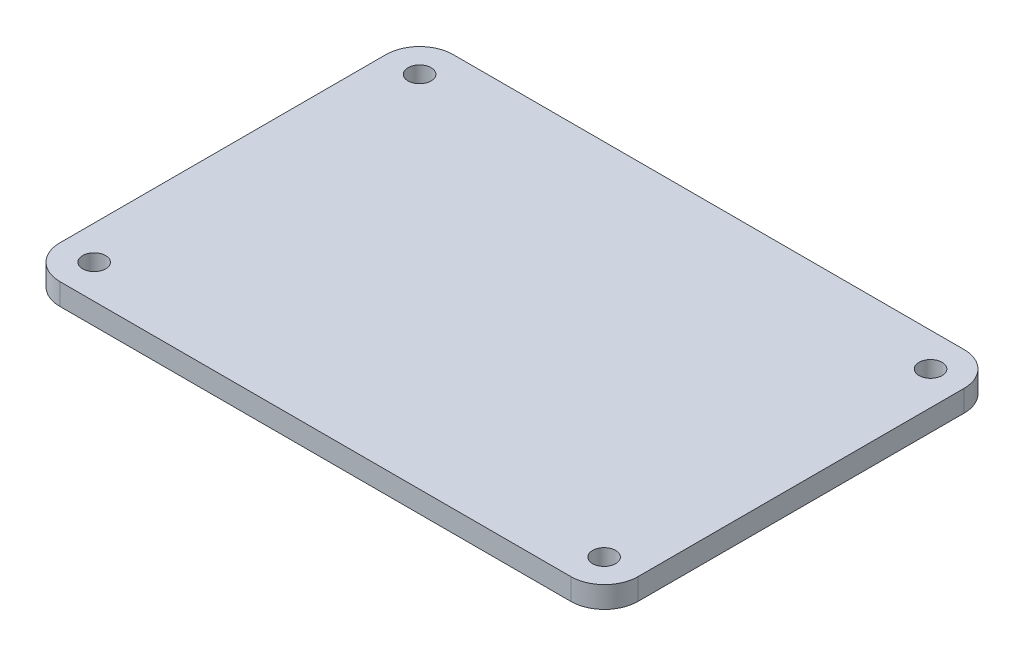
ISO-10303-21;
HEADER;
FILE_DESCRIPTION(('STEP AP214'),'2;1');
FILE_NAME('part.step','',(''),(''),'','','');
FILE_SCHEMA(('AUTOMOTIVE_DESIGN { 1 0 10303 214 1 1 1 1 }'));
ENDSEC;
DATA;
#1=APPLICATION_CONTEXT('core data for automotive mechanical design processes');
#2=APPLICATION_PROTOCOL_DEFINITION('international standard','automotive_design',2000,#1);
#3=PRODUCT_CONTEXT('',#1,'mechanical');
#4=PRODUCT('Part','Part','',(#3));
#5=PRODUCT_RELATED_PRODUCT_CATEGORY('part','',(#4));
#6=PRODUCT_DEFINITION_FORMATION('','',#4);
#7=PRODUCT_DEFINITION_CONTEXT('part definition',#1,'design');
#8=PRODUCT_DEFINITION('design','',#6,#7);
#9=PRODUCT_DEFINITION_SHAPE('','',#8);
#10=(LENGTH_UNIT() NAMED_UNIT(*) SI_UNIT(.MILLI.,.METRE.));
#11=(NAMED_UNIT(*) PLANE_ANGLE_UNIT() SI_UNIT($,.RADIAN.));
#12=(NAMED_UNIT(*) SI_UNIT($,.STERADIAN.) SOLID_ANGLE_UNIT());
#13=UNCERTAINTY_MEASURE_WITH_UNIT(LENGTH_MEASURE(1.E-05),#10,'distance_accuracy_value','');
#14=(GEOMETRIC_REPRESENTATION_CONTEXT(3) GLOBAL_UNCERTAINTY_ASSIGNED_CONTEXT((#13)) GLOBAL_UNIT_ASSIGNED_CONTEXT((#10,
#11,#12)) REPRESENTATION_CONTEXT('',''));
#15=CARTESIAN_POINT('',(0.,0.,0.));
#16=DIRECTION('',(0.,0.,1.));
#17=DIRECTION('',(1.,0.,0.));
#18=AXIS2_PLACEMENT_3D('',#15,#16,#17);
#19=CARTESIAN_POINT('',(110.992708305585,3.175,-138.788067041244));
#20=DIRECTION('',(0.,1.,0.));
#21=DIRECTION('',(0.,0.,1.));
#22=AXIS2_PLACEMENT_3D('',#19,#20,#21);
#23=PLANE('',#22);
#24=CARTESIAN_POINT('',(107.445530334738,3.175,-142.285856338533));
#25=DIRECTION('',(0.,1.,0.));
#26=DIRECTION('',(0.,0.,1.));
#27=AXIS2_PLACEMENT_3D('',#24,#25,#26);
#28=CIRCLE('',#27,1.7003914722854);
#29=CARTESIAN_POINT('',(107.445530334738,3.175,-140.585464866248));
#30=VERTEX_POINT('',#29);
#31=EDGE_CURVE('E217',#30,#30,#28,.T.);
#32=ORIENTED_EDGE('',*,*,#31,.F.);
#33=EDGE_LOOP('',(#32));
#34=FACE_BOUND('',#33,.T.);
#35=CARTESIAN_POINT('',(32.1803893114807,3.175,-190.337721151875));
#36=DIRECTION('',(0.,1.,0.));
#37=DIRECTION('',(0.,0.,1.));
#38=AXIS2_PLACEMENT_3D('',#35,#36,#37);
#39=CIRCLE('',#38,1.70038810793461);
#40=CARTESIAN_POINT('',(32.1803893114807,3.175,-188.63733304394));
#41=VERTEX_POINT('',#40);
#42=EDGE_CURVE('E229',#41,#41,#39,.T.);
#43=ORIENTED_EDGE('',*,*,#42,.F.);
#44=EDGE_LOOP('',(#43));
#45=FACE_BOUND('',#44,.T.);
#46=CARTESIAN_POINT('',(107.487861945513,3.175,-137.336384548185));
#47=CARTESIAN_POINT('',(110.22542094548,3.175,-137.336384548185));
#48=CARTESIAN_POINT('',(112.444385415682,3.175,-139.555359784311));
#49=CARTESIAN_POINT('',(112.444385415682,3.175,-142.292918784278));
#50=B_SPLINE_CURVE_WITH_KNOTS('',3,(#46,#47,#48,#49),.UNSPECIFIED.,.F.,.F.,(4,4),(7.,8.),.UNSPECIFIED.);
#51=CARTESIAN_POINT('',(107.487861945513,3.175,-137.336384548185));
#52=VERTEX_POINT('',#51);
#53=CARTESIAN_POINT('',(112.444385415682,3.175,-142.292918784278));
#54=VERTEX_POINT('',#53);
#55=EDGE_CURVE('E234',#52,#54,#50,.T.);
#56=ORIENTED_EDGE('',*,*,#55,.T.);
#57=DIRECTION('',(0.,0.,-1.));
#58=VECTOR('',#57,1.);
#59=CARTESIAN_POINT('',(112.444385415682,3.175,-190.380056799871));
#60=LINE('',#59,#58);
#61=CARTESIAN_POINT('',(112.444385415682,3.175,-190.380056799871));
#62=VERTEX_POINT('',#61);
#63=EDGE_CURVE('E94',#54,#62,#60,.T.);
#64=ORIENTED_EDGE('',*,*,#63,.T.);
#65=CARTESIAN_POINT('',(112.444385415682,3.175,-190.380056799871));
#66=CARTESIAN_POINT('',(112.444385415682,3.175,-193.117615799838));
#67=CARTESIAN_POINT('',(110.22542094548,3.175,-195.336585653002));
#68=CARTESIAN_POINT('',(107.487861945513,3.175,-195.336585653002));
#69=B_SPLINE_CURVE_WITH_KNOTS('',3,(#65,#66,#67,#68),.UNSPECIFIED.,.F.,.F.,(4,4),(5.,6.),.UNSPECIFIED.);
#70=CARTESIAN_POINT('',(107.487861945513,3.175,-195.336585653002));
#71=VERTEX_POINT('',#70);
#72=EDGE_CURVE('E160',#62,#71,#69,.T.);
#73=ORIENTED_EDGE('',*,*,#72,.T.);
#74=DIRECTION('',(-1.,0.,0.));
#75=VECTOR('',#74,1.);
#76=CARTESIAN_POINT('',(32.1345264778333,3.175,-195.336585653002));
#77=LINE('',#76,#75);
#78=CARTESIAN_POINT('',(32.1345264778333,3.175,-195.336585653002));
#79=VERTEX_POINT('',#78);
#80=EDGE_CURVE('E155',#71,#79,#77,.T.);
#81=ORIENTED_EDGE('',*,*,#80,.T.);
#82=CARTESIAN_POINT('',(32.1345264778333,3.175,-195.336585653002));
#83=CARTESIAN_POINT('',(29.3969701693475,3.175,-195.336585653002));
#84=CARTESIAN_POINT('',(27.1779976247024,3.175,-193.117610416876));
#85=CARTESIAN_POINT('',(27.1779976247024,3.175,-190.380056799871));
#86=B_SPLINE_CURVE_WITH_KNOTS('',3,(#82,#83,#84,#85),.UNSPECIFIED.,.F.,.F.,(4,4),(3.,4.),.UNSPECIFIED.);
#87=CARTESIAN_POINT('',(27.1779976247024,3.175,-190.380056799871));
#88=VERTEX_POINT('',#87);
#89=EDGE_CURVE('E113',#79,#88,#86,.T.);
#90=ORIENTED_EDGE('',*,*,#89,.T.);
#91=DIRECTION('',(0.,0.,1.));
#92=VECTOR('',#91,1.);
#93=CARTESIAN_POINT('',(27.1779976247024,3.175,-142.292908018355));
#94=LINE('',#93,#92);
#95=CARTESIAN_POINT('',(27.1779976247024,3.175,-142.292908018355));
#96=VERTEX_POINT('',#95);
#97=EDGE_CURVE('E107',#88,#96,#94,.T.);
#98=ORIENTED_EDGE('',*,*,#97,.T.);
#99=CARTESIAN_POINT('',(27.1779976247024,3.175,-142.292908018355));
#100=CARTESIAN_POINT('',(27.1779976247024,3.175,-139.555359784311));
#101=CARTESIAN_POINT('',(29.3969701693475,3.175,-137.336384548185));
#102=CARTESIAN_POINT('',(32.1345264778333,3.175,-137.336384548185));
#103=B_SPLINE_CURVE_WITH_KNOTS('',3,(#99,#100,#101,#102),.UNSPECIFIED.,.F.,.F.,(4,4),(1.,2.),.UNSPECIFIED.);
#104=CARTESIAN_POINT('',(32.1345264778333,3.175,-137.336384548185));
#105=VERTEX_POINT('',#104);
#106=EDGE_CURVE('E111',#96,#105,#103,.T.);
#107=ORIENTED_EDGE('',*,*,#106,.T.);
#108=DIRECTION('',(1.,0.,0.));
#109=VECTOR('',#108,1.);
#110=CARTESIAN_POINT('',(107.487861945513,3.175,-137.336384548185));
#111=LINE('',#110,#109);
#112=EDGE_CURVE('E51',#105,#52,#111,.T.);
#113=ORIENTED_EDGE('',*,*,#112,.T.);
#114=EDGE_LOOP('',(#56,#64,#73,#81,#90,#98,#107,#113));
#115=FACE_BOUND('',#114,.T.);
#116=CARTESIAN_POINT('',(32.1803893114807,3.175,-142.338781617925));
#117=DIRECTION('',(0.,1.,0.));
#118=DIRECTION('',(0.,0.,1.));
#119=AXIS2_PLACEMENT_3D('',#116,#117,#118);
#120=CIRCLE('',#119,1.70039012654498);
#121=CARTESIAN_POINT('',(32.1803893114807,3.175,-140.638391491381));
#122=VERTEX_POINT('',#121);
#123=EDGE_CURVE('E223',#122,#122,#120,.T.);
#124=ORIENTED_EDGE('',*,*,#123,.F.);
#125=EDGE_LOOP('',(#124));
#126=FACE_BOUND('',#125,.T.);
#127=CARTESIAN_POINT('',(107.494913625334,3.175,-190.387108479693));
#128=DIRECTION('',(0.,1.,0.));
#129=DIRECTION('',(0.,0.,1.));
#130=AXIS2_PLACEMENT_3D('',#127,#128,#129);
#131=CIRCLE('',#130,1.7003914722854);
#132=CARTESIAN_POINT('',(107.494913625334,3.175,-188.686717007407));
#133=VERTEX_POINT('',#132);
#134=EDGE_CURVE('E208',#133,#133,#131,.T.);
#135=ORIENTED_EDGE('',*,*,#134,.F.);
#136=EDGE_LOOP('',(#135));
#137=FACE_BOUND('',#136,.T.);
#138=ADVANCED_FACE('F33',(#34,#45,#115,#126,#137),#23,.T.);
#139=CARTESIAN_POINT('',(110.992708305585,0.,-138.788067041244));
#140=DIRECTION('',(0.,1.,0.));
#141=DIRECTION('',(0.,0.,1.));
#142=AXIS2_PLACEMENT_3D('',#139,#140,#141);
#143=PLANE('',#142);
#144=CARTESIAN_POINT('',(107.487861945513,0.,-137.336384548185));
#145=CARTESIAN_POINT('',(110.22542094548,0.,-137.336384548185));
#146=CARTESIAN_POINT('',(112.444385415682,0.,-139.555359784311));
#147=CARTESIAN_POINT('',(112.444385415682,0.,-142.292918784278));
#148=B_SPLINE_CURVE_WITH_KNOTS('',3,(#144,#145,#146,#147),.UNSPECIFIED.,.F.,.F.,(4,4),(7.,8.),.UNSPECIFIED.);
#149=CARTESIAN_POINT('',(107.487861945513,0.,-137.336384548185));
#150=VERTEX_POINT('',#149);
#151=CARTESIAN_POINT('',(112.444385415682,0.,-142.292918784278));
#152=VERTEX_POINT('',#151);
#153=EDGE_CURVE('E232',#150,#152,#148,.T.);
#154=ORIENTED_EDGE('',*,*,#153,.F.);
#155=DIRECTION('',(1.,0.,0.));
#156=VECTOR('',#155,1.);
#157=CARTESIAN_POINT('',(107.487861945513,0.,-137.336384548185));
#158=LINE('',#157,#156);
#159=CARTESIAN_POINT('',(32.1345264778333,0.,-137.336384548185));
#160=VERTEX_POINT('',#159);
#161=EDGE_CURVE('E86',#160,#150,#158,.T.);
#162=ORIENTED_EDGE('',*,*,#161,.F.);
#163=CARTESIAN_POINT('',(27.1779976247024,0.,-142.292908018355));
#164=CARTESIAN_POINT('',(27.1779976247024,0.,-139.555359784311));
#165=CARTESIAN_POINT('',(29.3969701693475,0.,-137.336384548185));
#166=CARTESIAN_POINT('',(32.1345264778333,0.,-137.336384548185));
#167=B_SPLINE_CURVE_WITH_KNOTS('',3,(#163,#164,#165,#166),.UNSPECIFIED.,.F.,.F.,(4,4),(1.,2.),.UNSPECIFIED.);
#168=CARTESIAN_POINT('',(27.1779976247024,0.,-142.292908018355));
#169=VERTEX_POINT('',#168);
#170=EDGE_CURVE('E80',#169,#160,#167,.T.);
#171=ORIENTED_EDGE('',*,*,#170,.F.);
#172=DIRECTION('',(0.,0.,1.));
#173=VECTOR('',#172,1.);
#174=CARTESIAN_POINT('',(27.1779976247024,0.,-142.292908018355));
#175=LINE('',#174,#173);
#176=CARTESIAN_POINT('',(27.1779976247024,0.,-190.380056799871));
#177=VERTEX_POINT('',#176);
#178=EDGE_CURVE('E121',#177,#169,#175,.T.);
#179=ORIENTED_EDGE('',*,*,#178,.F.);
#180=CARTESIAN_POINT('',(32.1345264778333,0.,-195.336585653002));
#181=CARTESIAN_POINT('',(29.3969701693475,0.,-195.336585653002));
#182=CARTESIAN_POINT('',(27.1779976247024,0.,-193.117610416876));
#183=CARTESIAN_POINT('',(27.1779976247024,0.,-190.380056799871));
#184=B_SPLINE_CURVE_WITH_KNOTS('',3,(#180,#181,#182,#183),.UNSPECIFIED.,.F.,.F.,(4,4),(3.,4.),.UNSPECIFIED.);
#185=CARTESIAN_POINT('',(32.1345264778333,0.,-195.336585653002));
#186=VERTEX_POINT('',#185);
#187=EDGE_CURVE('E269',#186,#177,#184,.T.);
#188=ORIENTED_EDGE('',*,*,#187,.F.);
#189=DIRECTION('',(-1.,0.,0.));
#190=VECTOR('',#189,1.);
#191=CARTESIAN_POINT('',(32.1345264778333,0.,-195.336585653002));
#192=LINE('',#191,#190);
#193=CARTESIAN_POINT('',(107.487861945513,0.,-195.336585653002));
#194=VERTEX_POINT('',#193);
#195=EDGE_CURVE('E267',#194,#186,#192,.T.);
#196=ORIENTED_EDGE('',*,*,#195,.F.);
#197=CARTESIAN_POINT('',(112.444385415682,0.,-190.380056799871));
#198=CARTESIAN_POINT('',(112.444385415682,0.,-193.117615799838));
#199=CARTESIAN_POINT('',(110.22542094548,0.,-195.336585653002));
#200=CARTESIAN_POINT('',(107.487861945513,0.,-195.336585653002));
#201=B_SPLINE_CURVE_WITH_KNOTS('',3,(#197,#198,#199,#200),.UNSPECIFIED.,.F.,.F.,(4,4),(5.,6.),.UNSPECIFIED.);
#202=CARTESIAN_POINT('',(112.444385415682,0.,-190.380056799871));
#203=VERTEX_POINT('',#202);
#204=EDGE_CURVE('E261',#203,#194,#201,.T.);
#205=ORIENTED_EDGE('',*,*,#204,.F.);
#206=DIRECTION('',(0.,0.,-1.));
#207=VECTOR('',#206,1.);
#208=CARTESIAN_POINT('',(112.444385415682,0.,-190.380056799871));
#209=LINE('',#208,#207);
#210=EDGE_CURVE('E265',#152,#203,#209,.T.);
#211=ORIENTED_EDGE('',*,*,#210,.F.);
#212=EDGE_LOOP('',(#154,#162,#171,#179,#188,#196,#205,#211));
#213=FACE_BOUND('',#212,.T.);
#214=CARTESIAN_POINT('',(32.1803893114807,0.,-190.337721151875));
#215=DIRECTION('',(0.,1.,0.));
#216=DIRECTION('',(0.,0.,1.));
#217=AXIS2_PLACEMENT_3D('',#214,#215,#216);
#218=CIRCLE('',#217,1.70038810793461);
#219=CARTESIAN_POINT('',(32.1803893114807,0.,-188.63733304394));
#220=VERTEX_POINT('',#219);
#221=EDGE_CURVE('E226',#220,#220,#218,.T.);
#222=ORIENTED_EDGE('',*,*,#221,.T.);
#223=EDGE_LOOP('',(#222));
#224=FACE_BOUND('',#223,.T.);
#225=CARTESIAN_POINT('',(32.1803893114807,0.,-142.338781617925));
#226=DIRECTION('',(0.,1.,0.));
#227=DIRECTION('',(0.,0.,1.));
#228=AXIS2_PLACEMENT_3D('',#225,#226,#227);
#229=CIRCLE('',#228,1.70039012654498);
#230=CARTESIAN_POINT('',(32.1803893114807,0.,-140.638391491381));
#231=VERTEX_POINT('',#230);
#232=EDGE_CURVE('E220',#231,#231,#229,.T.);
#233=ORIENTED_EDGE('',*,*,#232,.T.);
#234=EDGE_LOOP('',(#233));
#235=FACE_BOUND('',#234,.T.);
#236=CARTESIAN_POINT('',(107.445530334738,0.,-142.285856338533));
#237=DIRECTION('',(0.,1.,0.));
#238=DIRECTION('',(0.,0.,1.));
#239=AXIS2_PLACEMENT_3D('',#236,#237,#238);
#240=CIRCLE('',#239,1.7003914722854);
#241=CARTESIAN_POINT('',(107.445530334738,0.,-140.585464866248));
#242=VERTEX_POINT('',#241);
#243=EDGE_CURVE('E214',#242,#242,#240,.T.);
#244=ORIENTED_EDGE('',*,*,#243,.T.);
#245=EDGE_LOOP('',(#244));
#246=FACE_BOUND('',#245,.T.);
#247=CARTESIAN_POINT('',(107.494913625334,0.,-190.387108479693));
#248=DIRECTION('',(0.,1.,0.));
#249=DIRECTION('',(0.,0.,1.));
#250=AXIS2_PLACEMENT_3D('',#247,#248,#249);
#251=CIRCLE('',#250,1.7003914722854);
#252=CARTESIAN_POINT('',(107.494913625334,0.,-188.686717007407));
#253=VERTEX_POINT('',#252);
#254=EDGE_CURVE('E211',#253,#253,#251,.T.);
#255=ORIENTED_EDGE('',*,*,#254,.T.);
#256=EDGE_LOOP('',(#255));
#257=FACE_BOUND('',#256,.T.);
#258=ADVANCED_FACE('F176',(#213,#224,#235,#246,#257),#143,.F.);
#259=DIRECTION('',(0.,-1.,0.));
#260=VECTOR('',#259,1.);
#261=SURFACE_OF_LINEAR_EXTRUSION('',#50,#260);
#262=ORIENTED_EDGE('',*,*,#153,.T.);
#263=DIRECTION('',(0.,-1.,0.));
#264=VECTOR('',#263,1.);
#265=CARTESIAN_POINT('',(112.444385415682,3.175,-142.292918784278));
#266=LINE('',#265,#264);
#267=EDGE_CURVE('E11',#54,#152,#266,.T.);
#268=ORIENTED_EDGE('',*,*,#267,.F.);
#269=ORIENTED_EDGE('',*,*,#55,.F.);
#270=DIRECTION('',(0.,-1.,0.));
#271=VECTOR('',#270,1.);
#272=CARTESIAN_POINT('',(107.487861945513,3.175,-137.336384548185));
#273=LINE('',#272,#271);
#274=EDGE_CURVE('E127',#52,#150,#273,.T.);
#275=ORIENTED_EDGE('',*,*,#274,.T.);
#276=EDGE_LOOP('',(#262,#268,#269,#275));
#277=FACE_BOUND('',#276,.T.);
#278=ADVANCED_FACE('F35',(#277),#261,.F.);
#279=CARTESIAN_POINT('',(112.444385415682,3.175,-190.380056799871));
#280=DIRECTION('',(-1.,0.,0.));
#281=DIRECTION('',(0.,0.,1.));
#282=AXIS2_PLACEMENT_3D('',#279,#280,#281);
#283=PLANE('',#282);
#284=ORIENTED_EDGE('',*,*,#210,.T.);
#285=DIRECTION('',(0.,-1.,0.));
#286=VECTOR('',#285,1.);
#287=CARTESIAN_POINT('',(112.444385415682,3.175,-190.380056799871));
#288=LINE('',#287,#286);
#289=EDGE_CURVE('E43',#62,#203,#288,.T.);
#290=ORIENTED_EDGE('',*,*,#289,.F.);
#291=ORIENTED_EDGE('',*,*,#63,.F.);
#292=ORIENTED_EDGE('',*,*,#267,.T.);
#293=EDGE_LOOP('',(#284,#290,#291,#292));
#294=FACE_BOUND('',#293,.T.);
#295=ADVANCED_FACE('F170',(#294),#283,.F.);
#296=DIRECTION('',(0.,-1.,0.));
#297=VECTOR('',#296,1.);
#298=SURFACE_OF_LINEAR_EXTRUSION('',#69,#297);
#299=ORIENTED_EDGE('',*,*,#204,.T.);
#300=DIRECTION('',(0.,-1.,0.));
#301=VECTOR('',#300,1.);
#302=CARTESIAN_POINT('',(107.487861945513,3.175,-195.336585653002));
#303=LINE('',#302,#301);
#304=EDGE_CURVE('E255',#71,#194,#303,.T.);
#305=ORIENTED_EDGE('',*,*,#304,.F.);
#306=ORIENTED_EDGE('',*,*,#72,.F.);
#307=ORIENTED_EDGE('',*,*,#289,.T.);
#308=EDGE_LOOP('',(#299,#305,#306,#307));
#309=FACE_BOUND('',#308,.T.);
#310=ADVANCED_FACE('F168',(#309),#298,.F.);
#311=CARTESIAN_POINT('',(32.1345264778333,3.175,-195.336585653002));
#312=DIRECTION('',(0.,0.,1.));
#313=DIRECTION('',(1.,0.,0.));
#314=AXIS2_PLACEMENT_3D('',#311,#312,#313);
#315=PLANE('',#314);
#316=ORIENTED_EDGE('',*,*,#195,.T.);
#317=DIRECTION('',(0.,-1.,0.));
#318=VECTOR('',#317,1.);
#319=CARTESIAN_POINT('',(32.1345264778333,3.175,-195.336585653002));
#320=LINE('',#319,#318);
#321=EDGE_CURVE('E252',#79,#186,#320,.T.);
#322=ORIENTED_EDGE('',*,*,#321,.F.);
#323=ORIENTED_EDGE('',*,*,#80,.F.);
#324=ORIENTED_EDGE('',*,*,#304,.T.);
#325=EDGE_LOOP('',(#316,#322,#323,#324));
#326=FACE_BOUND('',#325,.T.);
#327=ADVANCED_FACE('F148',(#326),#315,.F.);
#328=DIRECTION('',(0.,-1.,0.));
#329=VECTOR('',#328,1.);
#330=SURFACE_OF_LINEAR_EXTRUSION('',#86,#329);
#331=ORIENTED_EDGE('',*,*,#187,.T.);
#332=DIRECTION('',(0.,-1.,0.));
#333=VECTOR('',#332,1.);
#334=CARTESIAN_POINT('',(27.1779976247024,3.175,-190.380056799871));
#335=LINE('',#334,#333);
#336=EDGE_CURVE('E122',#88,#177,#335,.T.);
#337=ORIENTED_EDGE('',*,*,#336,.F.);
#338=ORIENTED_EDGE('',*,*,#89,.F.);
#339=ORIENTED_EDGE('',*,*,#321,.T.);
#340=EDGE_LOOP('',(#331,#337,#338,#339));
#341=FACE_BOUND('',#340,.T.);
#342=ADVANCED_FACE('F145',(#341),#330,.F.);
#343=CARTESIAN_POINT('',(27.1779976247024,3.175,-142.292908018355));
#344=DIRECTION('',(1.,0.,0.));
#345=DIRECTION('',(0.,0.,-1.));
#346=AXIS2_PLACEMENT_3D('',#343,#344,#345);
#347=PLANE('',#346);
#348=ORIENTED_EDGE('',*,*,#178,.T.);
#349=DIRECTION('',(0.,-1.,0.));
#350=VECTOR('',#349,1.);
#351=CARTESIAN_POINT('',(27.1779976247024,3.175,-142.292908018355));
#352=LINE('',#351,#350);
#353=EDGE_CURVE('E118',#96,#169,#352,.T.);
#354=ORIENTED_EDGE('',*,*,#353,.F.);
#355=ORIENTED_EDGE('',*,*,#97,.F.);
#356=ORIENTED_EDGE('',*,*,#336,.T.);
#357=EDGE_LOOP('',(#348,#354,#355,#356));
#358=FACE_BOUND('',#357,.T.);
#359=ADVANCED_FACE('F119',(#358),#347,.F.);
#360=DIRECTION('',(0.,-1.,0.));
#361=VECTOR('',#360,1.);
#362=SURFACE_OF_LINEAR_EXTRUSION('',#103,#361);
#363=ORIENTED_EDGE('',*,*,#170,.T.);
#364=DIRECTION('',(0.,-1.,0.));
#365=VECTOR('',#364,1.);
#366=CARTESIAN_POINT('',(32.1345264778333,3.175,-137.336384548185));
#367=LINE('',#366,#365);
#368=EDGE_CURVE('E123',#105,#160,#367,.T.);
#369=ORIENTED_EDGE('',*,*,#368,.F.);
#370=ORIENTED_EDGE('',*,*,#106,.F.);
#371=ORIENTED_EDGE('',*,*,#353,.T.);
#372=EDGE_LOOP('',(#363,#369,#370,#371));
#373=FACE_BOUND('',#372,.T.);
#374=ADVANCED_FACE('F125',(#373),#362,.F.);
#375=CARTESIAN_POINT('',(107.487861945513,3.175,-137.336384548185));
#376=DIRECTION('',(0.,0.,-1.));
#377=DIRECTION('',(-1.,0.,0.));
#378=AXIS2_PLACEMENT_3D('',#375,#376,#377);
#379=PLANE('',#378);
#380=ORIENTED_EDGE('',*,*,#161,.T.);
#381=ORIENTED_EDGE('',*,*,#274,.F.);
#382=ORIENTED_EDGE('',*,*,#112,.F.);
#383=ORIENTED_EDGE('',*,*,#368,.T.);
#384=EDGE_LOOP('',(#380,#381,#382,#383));
#385=FACE_BOUND('',#384,.T.);
#386=ADVANCED_FACE('F141',(#385),#379,.F.);
#387=CARTESIAN_POINT('',(32.1803893114807,3.175,-190.337721151875));
#388=DIRECTION('',(0.,-1.,0.));
#389=DIRECTION('',(0.,0.,-1.));
#390=AXIS2_PLACEMENT_3D('',#387,#388,#389);
#391=CYLINDRICAL_SURFACE('',#390,1.70038810793461);
#392=ORIENTED_EDGE('',*,*,#42,.T.);
#393=EDGE_LOOP('',(#392));
#394=FACE_BOUND('',#393,.T.);
#395=ORIENTED_EDGE('',*,*,#221,.F.);
#396=EDGE_LOOP('',(#395));
#397=FACE_BOUND('',#396,.T.);
#398=ADVANCED_FACE('F188',(#394,#397),#391,.F.);
#399=CARTESIAN_POINT('',(32.1803893114807,3.175,-142.338781617925));
#400=DIRECTION('',(0.,-1.,0.));
#401=DIRECTION('',(0.,0.,-1.));
#402=AXIS2_PLACEMENT_3D('',#399,#400,#401);
#403=CYLINDRICAL_SURFACE('',#402,1.70039012654498);
#404=ORIENTED_EDGE('',*,*,#123,.T.);
#405=EDGE_LOOP('',(#404));
#406=FACE_BOUND('',#405,.T.);
#407=ORIENTED_EDGE('',*,*,#232,.F.);
#408=EDGE_LOOP('',(#407));
#409=FACE_BOUND('',#408,.T.);
#410=ADVANCED_FACE('F191',(#406,#409),#403,.F.);
#411=CARTESIAN_POINT('',(107.445530334738,3.175,-142.285856338533));
#412=DIRECTION('',(0.,-1.,0.));
#413=DIRECTION('',(0.,0.,-1.));
#414=AXIS2_PLACEMENT_3D('',#411,#412,#413);
#415=CYLINDRICAL_SURFACE('',#414,1.7003914722854);
#416=ORIENTED_EDGE('',*,*,#31,.T.);
#417=EDGE_LOOP('',(#416));
#418=FACE_BOUND('',#417,.T.);
#419=ORIENTED_EDGE('',*,*,#243,.F.);
#420=EDGE_LOOP('',(#419));
#421=FACE_BOUND('',#420,.T.);
#422=ADVANCED_FACE('F195',(#418,#421),#415,.F.);
#423=CARTESIAN_POINT('',(107.494913625334,3.175,-190.387108479693));
#424=DIRECTION('',(0.,-1.,0.));
#425=DIRECTION('',(0.,0.,-1.));
#426=AXIS2_PLACEMENT_3D('',#423,#424,#425);
#427=CYLINDRICAL_SURFACE('',#426,1.7003914722854);
#428=ORIENTED_EDGE('',*,*,#134,.T.);
#429=EDGE_LOOP('',(#428));
#430=FACE_BOUND('',#429,.T.);
#431=ORIENTED_EDGE('',*,*,#254,.F.);
#432=EDGE_LOOP('',(#431));
#433=FACE_BOUND('',#432,.T.);
#434=ADVANCED_FACE('F199',(#430,#433),#427,.F.);
#435=CLOSED_SHELL('',(#138,#258,#278,#295,#310,#327,#342,#359,#374,#386,#398,#410,#422,#434));
#436=MANIFOLD_SOLID_BREP('B2',#435);
#437=ADVANCED_BREP_SHAPE_REPRESENTATION('',(#18,#436),#14);
#438=SHAPE_DEFINITION_REPRESENTATION(#9,#437);
ENDSEC;
END-ISO-10303-21;
